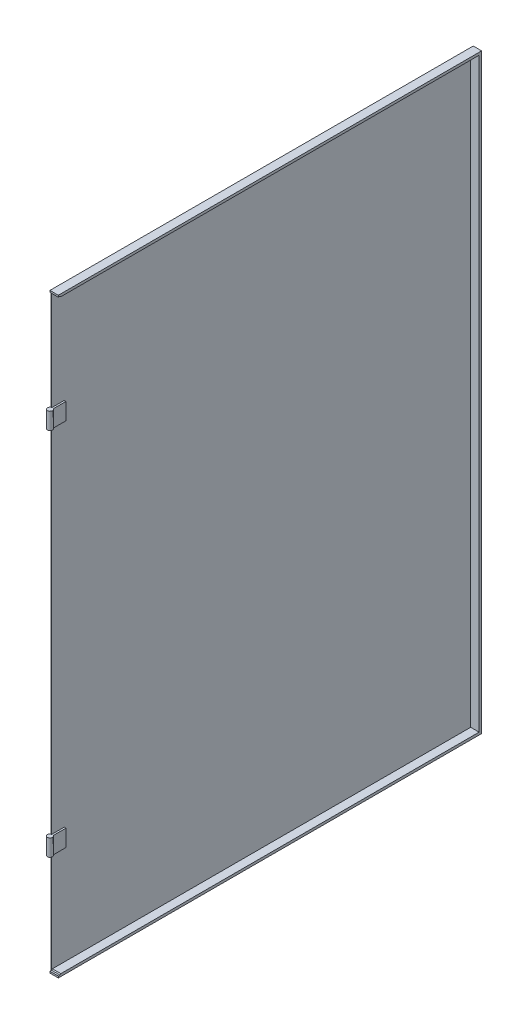
ISO-10303-21;
HEADER;
FILE_DESCRIPTION(('STEP AP214'),'2;1');
FILE_NAME('part.step','',(''),(''),'','','');
FILE_SCHEMA(('AUTOMOTIVE_DESIGN { 1 0 10303 214 1 1 1 1 }'));
ENDSEC;
DATA;
#1=APPLICATION_CONTEXT('core data for automotive mechanical design processes');
#2=APPLICATION_PROTOCOL_DEFINITION('international standard','automotive_design',2000,#1);
#3=PRODUCT_CONTEXT('',#1,'mechanical');
#4=PRODUCT('Part','Part','',(#3));
#5=PRODUCT_RELATED_PRODUCT_CATEGORY('part','',(#4));
#6=PRODUCT_DEFINITION_FORMATION('','',#4);
#7=PRODUCT_DEFINITION_CONTEXT('part definition',#1,'design');
#8=PRODUCT_DEFINITION('design','',#6,#7);
#9=PRODUCT_DEFINITION_SHAPE('','',#8);
#10=(LENGTH_UNIT() NAMED_UNIT(*) SI_UNIT(.MILLI.,.METRE.));
#11=(NAMED_UNIT(*) PLANE_ANGLE_UNIT() SI_UNIT($,.RADIAN.));
#12=(NAMED_UNIT(*) SI_UNIT($,.STERADIAN.) SOLID_ANGLE_UNIT());
#13=UNCERTAINTY_MEASURE_WITH_UNIT(LENGTH_MEASURE(1.E-05),#10,'distance_accuracy_value','');
#14=(GEOMETRIC_REPRESENTATION_CONTEXT(3) GLOBAL_UNCERTAINTY_ASSIGNED_CONTEXT((#13)) GLOBAL_UNIT_ASSIGNED_CONTEXT((#10,
#11,#12)) REPRESENTATION_CONTEXT('',''));
#15=CARTESIAN_POINT('',(0.,0.,0.));
#16=DIRECTION('',(0.,0.,1.));
#17=DIRECTION('',(1.,0.,0.));
#18=AXIS2_PLACEMENT_3D('',#15,#16,#17);
#19=CARTESIAN_POINT('',(0.,0.,500.));
#20=DIRECTION('',(0.,0.,-1.));
#21=DIRECTION('',(-1.,0.,0.));
#22=AXIS2_PLACEMENT_3D('',#19,#20,#21);
#23=PLANE('',#22);
#24=DIRECTION('',(1.,0.,0.));
#25=VECTOR('',#24,1.);
#26=CARTESIAN_POINT('',(-250.,-350.,500.));
#27=LINE('',#26,#25);
#28=CARTESIAN_POINT('',(-250.,-350.,500.));
#29=VERTEX_POINT('',#28);
#30=CARTESIAN_POINT('',(-249.,-350.,500.));
#31=VERTEX_POINT('',#30);
#32=EDGE_CURVE('E344',#29,#31,#27,.T.);
#33=ORIENTED_EDGE('',*,*,#32,.T.);
#34=DIRECTION('',(0.,-1.,0.));
#35=VECTOR('',#34,1.);
#36=CARTESIAN_POINT('',(-249.,0.,500.));
#37=LINE('',#36,#35);
#38=CARTESIAN_POINT('',(-249.,-230.,500.));
#39=VERTEX_POINT('',#38);
#40=EDGE_CURVE('E358',#39,#31,#37,.T.);
#41=ORIENTED_EDGE('',*,*,#40,.F.);
#42=DIRECTION('',(-1.,0.,0.));
#43=VECTOR('',#42,1.);
#44=CARTESIAN_POINT('',(0.,-230.,500.));
#45=LINE('',#44,#43);
#46=CARTESIAN_POINT('',(-250.,-230.,500.));
#47=VERTEX_POINT('',#46);
#48=EDGE_CURVE('E321',#39,#47,#45,.T.);
#49=ORIENTED_EDGE('',*,*,#48,.T.);
#50=DIRECTION('',(0.,-1.,0.));
#51=VECTOR('',#50,1.);
#52=CARTESIAN_POINT('',(-250.,-350.,500.));
#53=LINE('',#52,#51);
#54=EDGE_CURVE('E348',#47,#29,#53,.T.);
#55=ORIENTED_EDGE('',*,*,#54,.T.);
#56=EDGE_LOOP('',(#33,#41,#49,#55));
#57=FACE_BOUND('',#56,.T.);
#58=ADVANCED_FACE('F35',(#57),#23,.F.);
#59=CARTESIAN_POINT('',(-249.,350.,500.));
#60=VERTEX_POINT('',#59);
#61=CARTESIAN_POINT('',(-249.,230.,500.));
#62=VERTEX_POINT('',#61);
#63=EDGE_CURVE('E355',#60,#62,#37,.T.);
#64=ORIENTED_EDGE('',*,*,#63,.F.);
#65=DIRECTION('',(-1.,0.,0.));
#66=VECTOR('',#65,1.);
#67=CARTESIAN_POINT('',(-250.,350.,500.));
#68=LINE('',#67,#66);
#69=CARTESIAN_POINT('',(-250.,350.,500.));
#70=VERTEX_POINT('',#69);
#71=EDGE_CURVE('E347',#60,#70,#68,.T.);
#72=ORIENTED_EDGE('',*,*,#71,.T.);
#73=CARTESIAN_POINT('',(-250.,230.,500.));
#74=VERTEX_POINT('',#73);
#75=EDGE_CURVE('E349',#70,#74,#53,.T.);
#76=ORIENTED_EDGE('',*,*,#75,.T.);
#77=DIRECTION('',(-1.,0.,0.));
#78=VECTOR('',#77,1.);
#79=CARTESIAN_POINT('',(0.,230.,500.));
#80=LINE('',#79,#78);
#81=EDGE_CURVE('E413',#62,#74,#80,.T.);
#82=ORIENTED_EDGE('',*,*,#81,.F.);
#83=EDGE_LOOP('',(#64,#72,#76,#82));
#84=FACE_BOUND('',#83,.T.);
#85=ADVANCED_FACE('F443',(#84),#23,.F.);
#86=CARTESIAN_POINT('',(-250.,350.,500.));
#87=DIRECTION('',(0.,-1.,0.));
#88=DIRECTION('',(0.,0.,-1.));
#89=AXIS2_PLACEMENT_3D('',#86,#87,#88);
#90=PLANE('',#89);
#91=ORIENTED_EDGE('',*,*,#71,.F.);
#92=DIRECTION('',(0.,0.,-1.));
#93=VECTOR('',#92,1.);
#94=CARTESIAN_POINT('',(-249.,350.,500.));
#95=LINE('',#94,#93);
#96=CARTESIAN_POINT('',(-249.,350.,0.));
#97=VERTEX_POINT('',#96);
#98=EDGE_CURVE('E225',#60,#97,#95,.T.);
#99=ORIENTED_EDGE('',*,*,#98,.T.);
#100=DIRECTION('',(-1.,0.,0.));
#101=VECTOR('',#100,1.);
#102=CARTESIAN_POINT('',(-250.,350.,0.));
#103=LINE('',#102,#101);
#104=CARTESIAN_POINT('',(-250.,350.,0.));
#105=VERTEX_POINT('',#104);
#106=EDGE_CURVE('E339',#97,#105,#103,.T.);
#107=ORIENTED_EDGE('',*,*,#106,.T.);
#108=DIRECTION('',(0.,0.,-1.));
#109=VECTOR('',#108,1.);
#110=CARTESIAN_POINT('',(-250.,350.,500.));
#111=LINE('',#110,#109);
#112=EDGE_CURVE('E327',#70,#105,#111,.T.);
#113=ORIENTED_EDGE('',*,*,#112,.F.);
#114=EDGE_LOOP('',(#91,#99,#107,#113));
#115=FACE_BOUND('',#114,.T.);
#116=ADVANCED_FACE('F448',(#115),#90,.F.);
#117=CARTESIAN_POINT('',(-250.,-350.,500.));
#118=DIRECTION('',(0.,1.,0.));
#119=DIRECTION('',(0.,0.,1.));
#120=AXIS2_PLACEMENT_3D('',#117,#118,#119);
#121=PLANE('',#120);
#122=DIRECTION('',(1.,0.,0.));
#123=VECTOR('',#122,1.);
#124=CARTESIAN_POINT('',(-250.,-350.,0.));
#125=LINE('',#124,#123);
#126=CARTESIAN_POINT('',(-250.,-350.,0.));
#127=VERTEX_POINT('',#126);
#128=CARTESIAN_POINT('',(-249.,-350.,0.));
#129=VERTEX_POINT('',#128);
#130=EDGE_CURVE('E336',#127,#129,#125,.T.);
#131=ORIENTED_EDGE('',*,*,#130,.T.);
#132=DIRECTION('',(0.,0.,1.));
#133=VECTOR('',#132,1.);
#134=CARTESIAN_POINT('',(-249.,-350.,500.));
#135=LINE('',#134,#133);
#136=EDGE_CURVE('E318',#129,#31,#135,.T.);
#137=ORIENTED_EDGE('',*,*,#136,.T.);
#138=ORIENTED_EDGE('',*,*,#32,.F.);
#139=DIRECTION('',(0.,0.,-1.));
#140=VECTOR('',#139,1.);
#141=CARTESIAN_POINT('',(-250.,-350.,500.));
#142=LINE('',#141,#140);
#143=EDGE_CURVE('E332',#29,#127,#142,.T.);
#144=ORIENTED_EDGE('',*,*,#143,.T.);
#145=EDGE_LOOP('',(#131,#137,#138,#144));
#146=FACE_BOUND('',#145,.T.);
#147=ADVANCED_FACE('F457',(#146),#121,.F.);
#148=CARTESIAN_POINT('',(0.,0.,0.));
#149=DIRECTION('',(0.,0.,-1.));
#150=DIRECTION('',(-1.,0.,0.));
#151=AXIS2_PLACEMENT_3D('',#148,#149,#150);
#152=PLANE('',#151);
#153=ORIENTED_EDGE('',*,*,#106,.F.);
#154=DIRECTION('',(0.,1.,0.));
#155=VECTOR('',#154,1.);
#156=CARTESIAN_POINT('',(-249.,0.,0.));
#157=LINE('',#156,#155);
#158=EDGE_CURVE('E315',#129,#97,#157,.T.);
#159=ORIENTED_EDGE('',*,*,#158,.F.);
#160=ORIENTED_EDGE('',*,*,#130,.F.);
#161=DIRECTION('',(0.,-1.,0.));
#162=VECTOR('',#161,1.);
#163=CARTESIAN_POINT('',(-250.,-350.,0.));
#164=LINE('',#163,#162);
#165=EDGE_CURVE('E330',#105,#127,#164,.T.);
#166=ORIENTED_EDGE('',*,*,#165,.F.);
#167=EDGE_LOOP('',(#153,#159,#160,#166));
#168=FACE_BOUND('',#167,.T.);
#169=ADVANCED_FACE('F454',(#168),#152,.T.);
#170=CARTESIAN_POINT('',(-247.,210.,500.));
#171=DIRECTION('',(0.,1.,0.));
#172=DIRECTION('',(0.,0.,1.));
#173=AXIS2_PLACEMENT_3D('',#170,#171,#172);
#174=PLANE('',#173);
#175=DIRECTION('',(-1.,0.,0.));
#176=VECTOR('',#175,1.);
#177=CARTESIAN_POINT('',(0.,210.,500.));
#178=LINE('',#177,#176);
#179=CARTESIAN_POINT('',(-249.,210.,500.));
#180=VERTEX_POINT('',#179);
#181=CARTESIAN_POINT('',(-250.,210.,500.));
#182=VERTEX_POINT('',#181);
#183=EDGE_CURVE('E418',#180,#182,#178,.T.);
#184=ORIENTED_EDGE('',*,*,#183,.F.);
#185=DIRECTION('',(0.,0.,-1.));
#186=VECTOR('',#185,1.);
#187=CARTESIAN_POINT('',(-249.,210.,500.));
#188=LINE('',#187,#186);
#189=CARTESIAN_POINT('',(-249.,210.,485.));
#190=VERTEX_POINT('',#189);
#191=EDGE_CURVE('E335',#180,#190,#188,.T.);
#192=ORIENTED_EDGE('',*,*,#191,.T.);
#193=DIRECTION('',(-1.,0.,0.));
#194=VECTOR('',#193,1.);
#195=CARTESIAN_POINT('',(-247.,210.,485.));
#196=LINE('',#195,#194);
#197=CARTESIAN_POINT('',(-247.,210.,485.));
#198=VERTEX_POINT('',#197);
#199=EDGE_CURVE('E359',#198,#190,#196,.T.);
#200=ORIENTED_EDGE('',*,*,#199,.F.);
#201=DIRECTION('',(0.,0.,-1.));
#202=VECTOR('',#201,1.);
#203=CARTESIAN_POINT('',(-247.,210.,500.));
#204=LINE('',#203,#202);
#205=CARTESIAN_POINT('',(-247.,210.,499.901923788647));
#206=VERTEX_POINT('',#205);
#207=EDGE_CURVE('E376',#206,#198,#204,.T.);
#208=ORIENTED_EDGE('',*,*,#207,.F.);
#209=CARTESIAN_POINT('',(-248.5,210.,502.5));
#210=DIRECTION('',(0.,-1.,0.));
#211=DIRECTION('',(0.,0.,-1.));
#212=AXIS2_PLACEMENT_3D('',#209,#210,#211);
#213=CIRCLE('',#212,3.00000000000001);
#214=CARTESIAN_POINT('',(-250.,210.,499.901923788647));
#215=VERTEX_POINT('',#214);
#216=EDGE_CURVE('E352',#206,#215,#213,.T.);
#217=ORIENTED_EDGE('',*,*,#216,.T.);
#218=DIRECTION('',(0.,0.,-1.));
#219=VECTOR('',#218,1.);
#220=CARTESIAN_POINT('',(-250.,210.,500.));
#221=LINE('',#220,#219);
#222=EDGE_CURVE('E398',#182,#215,#221,.T.);
#223=ORIENTED_EDGE('',*,*,#222,.F.);
#224=EDGE_LOOP('',(#184,#192,#200,#208,#217,#223));
#225=FACE_BOUND('',#224,.T.);
#226=ADVANCED_FACE('F425',(#225),#174,.F.);
#227=CARTESIAN_POINT('',(-247.,230.,500.));
#228=DIRECTION('',(0.,-1.,0.));
#229=DIRECTION('',(0.,0.,-1.));
#230=AXIS2_PLACEMENT_3D('',#227,#228,#229);
#231=PLANE('',#230);
#232=DIRECTION('',(0.,0.,-1.));
#233=VECTOR('',#232,1.);
#234=CARTESIAN_POINT('',(-250.,230.,500.));
#235=LINE('',#234,#233);
#236=CARTESIAN_POINT('',(-250.,230.,499.901923788647));
#237=VERTEX_POINT('',#236);
#238=EDGE_CURVE('E409',#74,#237,#235,.T.);
#239=ORIENTED_EDGE('',*,*,#238,.T.);
#240=CARTESIAN_POINT('',(-248.5,230.,502.5));
#241=DIRECTION('',(0.,-1.,0.));
#242=DIRECTION('',(0.,0.,-1.));
#243=AXIS2_PLACEMENT_3D('',#240,#241,#242);
#244=CIRCLE('',#243,3.00000000000001);
#245=CARTESIAN_POINT('',(-247.,230.,499.901923788647));
#246=VERTEX_POINT('',#245);
#247=EDGE_CURVE('E39',#246,#237,#244,.T.);
#248=ORIENTED_EDGE('',*,*,#247,.F.);
#249=DIRECTION('',(0.,0.,1.));
#250=VECTOR('',#249,1.);
#251=CARTESIAN_POINT('',(-247.,230.,500.));
#252=LINE('',#251,#250);
#253=CARTESIAN_POINT('',(-247.,230.,485.));
#254=VERTEX_POINT('',#253);
#255=EDGE_CURVE('E371',#254,#246,#252,.T.);
#256=ORIENTED_EDGE('',*,*,#255,.F.);
#257=DIRECTION('',(-1.,0.,0.));
#258=VECTOR('',#257,1.);
#259=CARTESIAN_POINT('',(-247.,230.,485.));
#260=LINE('',#259,#258);
#261=CARTESIAN_POINT('',(-249.,230.,485.));
#262=VERTEX_POINT('',#261);
#263=EDGE_CURVE('E364',#254,#262,#260,.T.);
#264=ORIENTED_EDGE('',*,*,#263,.T.);
#265=DIRECTION('',(0.,0.,1.));
#266=VECTOR('',#265,1.);
#267=CARTESIAN_POINT('',(-249.,230.,500.));
#268=LINE('',#267,#266);
#269=EDGE_CURVE('E362',#262,#62,#268,.T.);
#270=ORIENTED_EDGE('',*,*,#269,.T.);
#271=ORIENTED_EDGE('',*,*,#81,.T.);
#272=EDGE_LOOP('',(#239,#248,#256,#264,#270,#271));
#273=FACE_BOUND('',#272,.T.);
#274=ADVANCED_FACE('F438',(#273),#231,.F.);
#275=CARTESIAN_POINT('',(-247.,-230.,500.));
#276=DIRECTION('',(0.,1.,0.));
#277=DIRECTION('',(0.,0.,1.));
#278=AXIS2_PLACEMENT_3D('',#275,#276,#277);
#279=PLANE('',#278);
#280=ORIENTED_EDGE('',*,*,#48,.F.);
#281=DIRECTION('',(0.,0.,-1.));
#282=VECTOR('',#281,1.);
#283=CARTESIAN_POINT('',(-249.,-230.,500.));
#284=LINE('',#283,#282);
#285=CARTESIAN_POINT('',(-249.,-230.,485.));
#286=VERTEX_POINT('',#285);
#287=EDGE_CURVE('E373',#39,#286,#284,.T.);
#288=ORIENTED_EDGE('',*,*,#287,.T.);
#289=DIRECTION('',(-1.,0.,0.));
#290=VECTOR('',#289,1.);
#291=CARTESIAN_POINT('',(-247.,-230.,485.));
#292=LINE('',#291,#290);
#293=CARTESIAN_POINT('',(-247.,-230.,485.));
#294=VERTEX_POINT('',#293);
#295=EDGE_CURVE('E378',#294,#286,#292,.T.);
#296=ORIENTED_EDGE('',*,*,#295,.F.);
#297=DIRECTION('',(0.,0.,-1.));
#298=VECTOR('',#297,1.);
#299=CARTESIAN_POINT('',(-247.,-230.,500.));
#300=LINE('',#299,#298);
#301=CARTESIAN_POINT('',(-247.,-230.,499.901923788647));
#302=VERTEX_POINT('',#301);
#303=EDGE_CURVE('E386',#302,#294,#300,.T.);
#304=ORIENTED_EDGE('',*,*,#303,.F.);
#305=CARTESIAN_POINT('',(-248.5,-230.,502.5));
#306=DIRECTION('',(0.,-1.,0.));
#307=DIRECTION('',(0.,0.,-1.));
#308=AXIS2_PLACEMENT_3D('',#305,#306,#307);
#309=CIRCLE('',#308,2.99999999999999);
#310=CARTESIAN_POINT('',(-250.,-230.,499.901923788647));
#311=VERTEX_POINT('',#310);
#312=EDGE_CURVE('E404',#302,#311,#309,.T.);
#313=ORIENTED_EDGE('',*,*,#312,.T.);
#314=DIRECTION('',(0.,0.,-1.));
#315=VECTOR('',#314,1.);
#316=CARTESIAN_POINT('',(-250.,-230.,500.));
#317=LINE('',#316,#315);
#318=EDGE_CURVE('E341',#47,#311,#317,.T.);
#319=ORIENTED_EDGE('',*,*,#318,.F.);
#320=EDGE_LOOP('',(#280,#288,#296,#304,#313,#319));
#321=FACE_BOUND('',#320,.T.);
#322=ADVANCED_FACE('F548',(#321),#279,.F.);
#323=CARTESIAN_POINT('',(-247.,-210.,500.));
#324=DIRECTION('',(0.,-1.,0.));
#325=DIRECTION('',(0.,0.,-1.));
#326=AXIS2_PLACEMENT_3D('',#323,#324,#325);
#327=PLANE('',#326);
#328=DIRECTION('',(0.,0.,-1.));
#329=VECTOR('',#328,1.);
#330=CARTESIAN_POINT('',(-250.,-210.,500.));
#331=LINE('',#330,#329);
#332=CARTESIAN_POINT('',(-250.,-210.,500.));
#333=VERTEX_POINT('',#332);
#334=CARTESIAN_POINT('',(-250.,-210.,499.901923788647));
#335=VERTEX_POINT('',#334);
#336=EDGE_CURVE('E331',#333,#335,#331,.T.);
#337=ORIENTED_EDGE('',*,*,#336,.T.);
#338=CARTESIAN_POINT('',(-248.5,-210.,502.5));
#339=DIRECTION('',(0.,-1.,0.));
#340=DIRECTION('',(0.,0.,-1.));
#341=AXIS2_PLACEMENT_3D('',#338,#339,#340);
#342=CIRCLE('',#341,2.99999999999999);
#343=CARTESIAN_POINT('',(-247.,-210.,499.901923788647));
#344=VERTEX_POINT('',#343);
#345=EDGE_CURVE('E325',#344,#335,#342,.T.);
#346=ORIENTED_EDGE('',*,*,#345,.F.);
#347=DIRECTION('',(0.,0.,1.));
#348=VECTOR('',#347,1.);
#349=CARTESIAN_POINT('',(-247.,-210.,500.));
#350=LINE('',#349,#348);
#351=CARTESIAN_POINT('',(-247.,-210.,485.));
#352=VERTEX_POINT('',#351);
#353=EDGE_CURVE('E326',#352,#344,#350,.T.);
#354=ORIENTED_EDGE('',*,*,#353,.F.);
#355=DIRECTION('',(-1.,0.,0.));
#356=VECTOR('',#355,1.);
#357=CARTESIAN_POINT('',(-247.,-210.,485.));
#358=LINE('',#357,#356);
#359=CARTESIAN_POINT('',(-249.,-210.,485.));
#360=VERTEX_POINT('',#359);
#361=EDGE_CURVE('E383',#352,#360,#358,.T.);
#362=ORIENTED_EDGE('',*,*,#361,.T.);
#363=DIRECTION('',(0.,0.,1.));
#364=VECTOR('',#363,1.);
#365=CARTESIAN_POINT('',(-249.,-210.,500.));
#366=LINE('',#365,#364);
#367=CARTESIAN_POINT('',(-249.,-210.,500.));
#368=VERTEX_POINT('',#367);
#369=EDGE_CURVE('E381',#360,#368,#366,.T.);
#370=ORIENTED_EDGE('',*,*,#369,.T.);
#371=DIRECTION('',(-1.,0.,0.));
#372=VECTOR('',#371,1.);
#373=CARTESIAN_POINT('',(0.,-210.,500.));
#374=LINE('',#373,#372);
#375=EDGE_CURVE('E401',#368,#333,#374,.T.);
#376=ORIENTED_EDGE('',*,*,#375,.T.);
#377=EDGE_LOOP('',(#337,#346,#354,#362,#370,#376));
#378=FACE_BOUND('',#377,.T.);
#379=ADVANCED_FACE('F523',(#378),#327,.F.);
#380=CARTESIAN_POINT('',(-250.,-350.,500.));
#381=DIRECTION('',(1.,0.,0.));
#382=DIRECTION('',(0.,0.,-1.));
#383=AXIS2_PLACEMENT_3D('',#380,#381,#382);
#384=PLANE('',#383);
#385=ORIENTED_EDGE('',*,*,#238,.F.);
#386=ORIENTED_EDGE('',*,*,#75,.F.);
#387=ORIENTED_EDGE('',*,*,#112,.T.);
#388=ORIENTED_EDGE('',*,*,#165,.T.);
#389=ORIENTED_EDGE('',*,*,#143,.F.);
#390=ORIENTED_EDGE('',*,*,#54,.F.);
#391=ORIENTED_EDGE('',*,*,#318,.T.);
#392=DIRECTION('',(0.,-1.,0.));
#393=VECTOR('',#392,1.);
#394=CARTESIAN_POINT('',(-250.,-210.,499.901923788647));
#395=LINE('',#394,#393);
#396=EDGE_CURVE('E395',#311,#335,#395,.F.);
#397=ORIENTED_EDGE('',*,*,#396,.T.);
#398=ORIENTED_EDGE('',*,*,#336,.F.);
#399=EDGE_CURVE('E353',#182,#333,#53,.T.);
#400=ORIENTED_EDGE('',*,*,#399,.F.);
#401=ORIENTED_EDGE('',*,*,#222,.T.);
#402=DIRECTION('',(0.,-1.,0.));
#403=VECTOR('',#402,1.);
#404=CARTESIAN_POINT('',(-250.,230.,499.901923788647));
#405=LINE('',#404,#403);
#406=EDGE_CURVE('E11',#237,#215,#405,.T.);
#407=ORIENTED_EDGE('',*,*,#406,.F.);
#408=EDGE_LOOP('',(#385,#386,#387,#388,#389,#390,#391,#397,#398,#400,#401,#407));
#409=FACE_BOUND('',#408,.T.);
#410=ADVANCED_FACE('F432',(#409),#384,.F.);
#411=EDGE_CURVE('E343',#180,#368,#37,.T.);
#412=ORIENTED_EDGE('',*,*,#411,.F.);
#413=ORIENTED_EDGE('',*,*,#183,.T.);
#414=ORIENTED_EDGE('',*,*,#399,.T.);
#415=ORIENTED_EDGE('',*,*,#375,.F.);
#416=EDGE_LOOP('',(#412,#413,#414,#415));
#417=FACE_BOUND('',#416,.T.);
#418=ADVANCED_FACE('F37',(#417),#23,.F.);
#419=CARTESIAN_POINT('',(-249.,-350.,500.));
#420=DIRECTION('',(1.,0.,0.));
#421=DIRECTION('',(0.,0.,-1.));
#422=AXIS2_PLACEMENT_3D('',#419,#420,#421);
#423=PLANE('',#422);
#424=DIRECTION('',(0.,0.707106781186548,-0.707106781186548));
#425=VECTOR('',#424,1.);
#426=CARTESIAN_POINT('',(-249.,75.,75.));
#427=LINE('',#426,#425);
#428=CARTESIAN_POINT('',(-249.,-349.,499.));
#429=VERTEX_POINT('',#428);
#430=EDGE_CURVE('E51',#31,#429,#427,.T.);
#431=ORIENTED_EDGE('',*,*,#430,.T.);
#432=DIRECTION('',(0.,0.,-1.));
#433=VECTOR('',#432,1.);
#434=CARTESIAN_POINT('',(-249.,-349.,0.));
#435=LINE('',#434,#433);
#436=CARTESIAN_POINT('',(-249.,-349.,1.));
#437=VERTEX_POINT('',#436);
#438=EDGE_CURVE('E56',#429,#437,#435,.T.);
#439=ORIENTED_EDGE('',*,*,#438,.T.);
#440=DIRECTION('',(0.,1.,0.));
#441=VECTOR('',#440,1.);
#442=CARTESIAN_POINT('',(-249.,0.,1.));
#443=LINE('',#442,#441);
#444=CARTESIAN_POINT('',(-249.,349.,1.));
#445=VERTEX_POINT('',#444);
#446=EDGE_CURVE('E266',#437,#445,#443,.T.);
#447=ORIENTED_EDGE('',*,*,#446,.T.);
#448=DIRECTION('',(0.,0.,1.));
#449=VECTOR('',#448,1.);
#450=CARTESIAN_POINT('',(-249.,349.,0.));
#451=LINE('',#450,#449);
#452=CARTESIAN_POINT('',(-249.,349.,499.));
#453=VERTEX_POINT('',#452);
#454=EDGE_CURVE('E221',#445,#453,#451,.T.);
#455=ORIENTED_EDGE('',*,*,#454,.T.);
#456=DIRECTION('',(0.,0.707106781186548,0.707106781186548));
#457=VECTOR('',#456,1.);
#458=CARTESIAN_POINT('',(-249.,-75.,75.));
#459=LINE('',#458,#457);
#460=EDGE_CURVE('E237',#453,#60,#459,.T.);
#461=ORIENTED_EDGE('',*,*,#460,.T.);
#462=ORIENTED_EDGE('',*,*,#63,.T.);
#463=ORIENTED_EDGE('',*,*,#269,.F.);
#464=DIRECTION('',(0.,1.,0.));
#465=VECTOR('',#464,1.);
#466=CARTESIAN_POINT('',(-249.,230.,485.));
#467=LINE('',#466,#465);
#468=EDGE_CURVE('E363',#190,#262,#467,.T.);
#469=ORIENTED_EDGE('',*,*,#468,.F.);
#470=ORIENTED_EDGE('',*,*,#191,.F.);
#471=ORIENTED_EDGE('',*,*,#411,.T.);
#472=ORIENTED_EDGE('',*,*,#369,.F.);
#473=DIRECTION('',(0.,1.,0.));
#474=VECTOR('',#473,1.);
#475=CARTESIAN_POINT('',(-249.,-210.,485.));
#476=LINE('',#475,#474);
#477=EDGE_CURVE('E382',#286,#360,#476,.T.);
#478=ORIENTED_EDGE('',*,*,#477,.F.);
#479=ORIENTED_EDGE('',*,*,#287,.F.);
#480=ORIENTED_EDGE('',*,*,#40,.T.);
#481=EDGE_LOOP('',(#431,#439,#447,#455,#461,#462,#463,#469,#470,#471,#472,#478,#479,#480));
#482=FACE_BOUND('',#481,.T.);
#483=ADVANCED_FACE('F473',(#482),#423,.T.);
#484=CARTESIAN_POINT('',(-247.,230.,485.));
#485=DIRECTION('',(0.,0.,1.));
#486=DIRECTION('',(1.,0.,0.));
#487=AXIS2_PLACEMENT_3D('',#484,#485,#486);
#488=PLANE('',#487);
#489=ORIENTED_EDGE('',*,*,#468,.T.);
#490=ORIENTED_EDGE('',*,*,#263,.F.);
#491=DIRECTION('',(0.,1.,0.));
#492=VECTOR('',#491,1.);
#493=CARTESIAN_POINT('',(-247.,230.,485.));
#494=LINE('',#493,#492);
#495=EDGE_CURVE('E374',#198,#254,#494,.T.);
#496=ORIENTED_EDGE('',*,*,#495,.F.);
#497=ORIENTED_EDGE('',*,*,#199,.T.);
#498=EDGE_LOOP('',(#489,#490,#496,#497));
#499=FACE_BOUND('',#498,.T.);
#500=ADVANCED_FACE('F521',(#499),#488,.F.);
#501=CARTESIAN_POINT('',(-247.,0.,0.));
#502=DIRECTION('',(1.,0.,0.));
#503=DIRECTION('',(0.,0.,-1.));
#504=AXIS2_PLACEMENT_3D('',#501,#502,#503);
#505=PLANE('',#504);
#506=DIRECTION('',(0.,-1.,0.));
#507=VECTOR('',#506,1.);
#508=CARTESIAN_POINT('',(-247.,230.,499.901923788647));
#509=LINE('',#508,#507);
#510=EDGE_CURVE('E366',#246,#206,#509,.T.);
#511=ORIENTED_EDGE('',*,*,#510,.T.);
#512=ORIENTED_EDGE('',*,*,#207,.T.);
#513=ORIENTED_EDGE('',*,*,#495,.T.);
#514=ORIENTED_EDGE('',*,*,#255,.T.);
#515=EDGE_LOOP('',(#511,#512,#513,#514));
#516=FACE_BOUND('',#515,.T.);
#517=ADVANCED_FACE('F534',(#516),#505,.T.);
#518=CARTESIAN_POINT('',(-247.,-210.,485.));
#519=DIRECTION('',(0.,0.,1.));
#520=DIRECTION('',(1.,0.,0.));
#521=AXIS2_PLACEMENT_3D('',#518,#519,#520);
#522=PLANE('',#521);
#523=ORIENTED_EDGE('',*,*,#477,.T.);
#524=ORIENTED_EDGE('',*,*,#361,.F.);
#525=DIRECTION('',(0.,1.,0.));
#526=VECTOR('',#525,1.);
#527=CARTESIAN_POINT('',(-247.,-210.,485.));
#528=LINE('',#527,#526);
#529=EDGE_CURVE('E392',#294,#352,#528,.T.);
#530=ORIENTED_EDGE('',*,*,#529,.F.);
#531=ORIENTED_EDGE('',*,*,#295,.T.);
#532=EDGE_LOOP('',(#523,#524,#530,#531));
#533=FACE_BOUND('',#532,.T.);
#534=ADVANCED_FACE('F536',(#533),#522,.F.);
#535=CARTESIAN_POINT('',(-247.,0.,0.));
#536=DIRECTION('',(1.,0.,0.));
#537=DIRECTION('',(0.,0.,-1.));
#538=AXIS2_PLACEMENT_3D('',#535,#536,#537);
#539=PLANE('',#538);
#540=DIRECTION('',(0.,-1.,0.));
#541=VECTOR('',#540,1.);
#542=CARTESIAN_POINT('',(-247.,-210.,499.901923788647));
#543=LINE('',#542,#541);
#544=EDGE_CURVE('E322',#302,#344,#543,.F.);
#545=ORIENTED_EDGE('',*,*,#544,.F.);
#546=ORIENTED_EDGE('',*,*,#303,.T.);
#547=ORIENTED_EDGE('',*,*,#529,.T.);
#548=ORIENTED_EDGE('',*,*,#353,.T.);
#549=EDGE_LOOP('',(#545,#546,#547,#548));
#550=FACE_BOUND('',#549,.T.);
#551=ADVANCED_FACE('F542',(#550),#539,.T.);
#552=CARTESIAN_POINT('',(-248.5,-210.,502.5));
#553=DIRECTION('',(0.,-1.,0.));
#554=DIRECTION('',(0.,0.,-1.));
#555=AXIS2_PLACEMENT_3D('',#552,#553,#554);
#556=CYLINDRICAL_SURFACE('',#555,2.99999999999999);
#557=ORIENTED_EDGE('',*,*,#396,.F.);
#558=ORIENTED_EDGE('',*,*,#312,.F.);
#559=ORIENTED_EDGE('',*,*,#544,.T.);
#560=ORIENTED_EDGE('',*,*,#345,.T.);
#561=EDGE_LOOP('',(#557,#558,#559,#560));
#562=FACE_BOUND('',#561,.T.);
#563=ADVANCED_FACE('F557',(#562),#556,.T.);
#564=CARTESIAN_POINT('',(-248.5,230.,502.5));
#565=DIRECTION('',(0.,-1.,0.));
#566=DIRECTION('',(0.,0.,-1.));
#567=AXIS2_PLACEMENT_3D('',#564,#565,#566);
#568=CYLINDRICAL_SURFACE('',#567,3.00000000000001);
#569=ORIENTED_EDGE('',*,*,#216,.F.);
#570=ORIENTED_EDGE('',*,*,#510,.F.);
#571=ORIENTED_EDGE('',*,*,#247,.T.);
#572=ORIENTED_EDGE('',*,*,#406,.T.);
#573=EDGE_LOOP('',(#569,#570,#571,#572));
#574=FACE_BOUND('',#573,.T.);
#575=ADVANCED_FACE('F434',(#574),#568,.T.);
#576=CARTESIAN_POINT('',(-249.,0.,0.));
#577=DIRECTION('',(1.,0.,0.));
#578=DIRECTION('',(0.,0.,-1.));
#579=AXIS2_PLACEMENT_3D('',#576,#577,#578);
#580=PLANE('',#579);
#581=ORIENTED_EDGE('',*,*,#158,.T.);
#582=ORIENTED_EDGE('',*,*,#98,.F.);
#583=DIRECTION('',(0.,0.,1.));
#584=VECTOR('',#583,1.);
#585=CARTESIAN_POINT('',(-249.,350.,0.));
#586=LINE('',#585,#584);
#587=CARTESIAN_POINT('',(-249.,350.,502.));
#588=VERTEX_POINT('',#587);
#589=EDGE_CURVE('E284',#60,#588,#586,.T.);
#590=ORIENTED_EDGE('',*,*,#589,.T.);
#591=DIRECTION('',(0.,-1.,0.));
#592=VECTOR('',#591,1.);
#593=CARTESIAN_POINT('',(-249.,0.,502.));
#594=LINE('',#593,#592);
#595=CARTESIAN_POINT('',(-249.,352.,502.));
#596=VERTEX_POINT('',#595);
#597=EDGE_CURVE('E281',#596,#588,#594,.T.);
#598=ORIENTED_EDGE('',*,*,#597,.F.);
#599=DIRECTION('',(0.,0.,1.));
#600=VECTOR('',#599,1.);
#601=CARTESIAN_POINT('',(-249.,352.,0.));
#602=LINE('',#601,#600);
#603=CARTESIAN_POINT('',(-249.,352.,-2.));
#604=VERTEX_POINT('',#603);
#605=EDGE_CURVE('E279',#604,#596,#602,.T.);
#606=ORIENTED_EDGE('',*,*,#605,.F.);
#607=DIRECTION('',(0.,1.,0.));
#608=VECTOR('',#607,1.);
#609=CARTESIAN_POINT('',(-249.,0.,-2.));
#610=LINE('',#609,#608);
#611=CARTESIAN_POINT('',(-249.,-352.,-2.));
#612=VERTEX_POINT('',#611);
#613=EDGE_CURVE('E277',#612,#604,#610,.T.);
#614=ORIENTED_EDGE('',*,*,#613,.F.);
#615=DIRECTION('',(0.,0.,-1.));
#616=VECTOR('',#615,1.);
#617=CARTESIAN_POINT('',(-249.,-352.,0.));
#618=LINE('',#617,#616);
#619=CARTESIAN_POINT('',(-249.,-352.,502.));
#620=VERTEX_POINT('',#619);
#621=EDGE_CURVE('E275',#620,#612,#618,.T.);
#622=ORIENTED_EDGE('',*,*,#621,.F.);
#623=DIRECTION('',(0.,-1.,0.));
#624=VECTOR('',#623,1.);
#625=CARTESIAN_POINT('',(-249.,0.,502.));
#626=LINE('',#625,#624);
#627=CARTESIAN_POINT('',(-249.,-350.,502.));
#628=VERTEX_POINT('',#627);
#629=EDGE_CURVE('E273',#628,#620,#626,.T.);
#630=ORIENTED_EDGE('',*,*,#629,.F.);
#631=DIRECTION('',(0.,0.,-1.));
#632=VECTOR('',#631,1.);
#633=CARTESIAN_POINT('',(-249.,-350.,0.));
#634=LINE('',#633,#632);
#635=EDGE_CURVE('E270',#628,#31,#634,.T.);
#636=ORIENTED_EDGE('',*,*,#635,.T.);
#637=ORIENTED_EDGE('',*,*,#136,.F.);
#638=EDGE_LOOP('',(#581,#582,#590,#598,#606,#614,#622,#630,#636,#637));
#639=FACE_BOUND('',#638,.T.);
#640=ADVANCED_FACE('F460',(#639),#580,.F.);
#641=CARTESIAN_POINT('',(-239.,349.,0.));
#642=DIRECTION('',(0.,-1.,0.));
#643=DIRECTION('',(0.,0.,-1.));
#644=AXIS2_PLACEMENT_3D('',#641,#642,#643);
#645=PLANE('',#644);
#646=ORIENTED_EDGE('',*,*,#454,.F.);
#647=DIRECTION('',(-1.,0.,0.));
#648=VECTOR('',#647,1.);
#649=CARTESIAN_POINT('',(-239.,349.,1.));
#650=LINE('',#649,#648);
#651=CARTESIAN_POINT('',(-239.,349.,1.));
#652=VERTEX_POINT('',#651);
#653=EDGE_CURVE('E215',#652,#445,#650,.T.);
#654=ORIENTED_EDGE('',*,*,#653,.F.);
#655=DIRECTION('',(0.,0.,1.));
#656=VECTOR('',#655,1.);
#657=CARTESIAN_POINT('',(-239.,349.,0.));
#658=LINE('',#657,#656);
#659=CARTESIAN_POINT('',(-239.,349.,499.));
#660=VERTEX_POINT('',#659);
#661=EDGE_CURVE('E219',#652,#660,#658,.T.);
#662=ORIENTED_EDGE('',*,*,#661,.T.);
#663=DIRECTION('',(-1.,0.,0.));
#664=VECTOR('',#663,1.);
#665=CARTESIAN_POINT('',(-239.,349.,499.));
#666=LINE('',#665,#664);
#667=EDGE_CURVE('E264',#660,#453,#666,.T.);
#668=ORIENTED_EDGE('',*,*,#667,.T.);
#669=EDGE_LOOP('',(#646,#654,#662,#668));
#670=FACE_BOUND('',#669,.T.);
#671=ADVANCED_FACE('F217',(#670),#645,.T.);
#672=CARTESIAN_POINT('',(-239.,0.,1.));
#673=DIRECTION('',(0.,0.,1.));
#674=DIRECTION('',(1.,0.,0.));
#675=AXIS2_PLACEMENT_3D('',#672,#673,#674);
#676=PLANE('',#675);
#677=ORIENTED_EDGE('',*,*,#446,.F.);
#678=DIRECTION('',(-1.,0.,0.));
#679=VECTOR('',#678,1.);
#680=CARTESIAN_POINT('',(-239.,-349.,1.));
#681=LINE('',#680,#679);
#682=CARTESIAN_POINT('',(-239.,-349.,1.));
#683=VERTEX_POINT('',#682);
#684=EDGE_CURVE('E226',#683,#437,#681,.T.);
#685=ORIENTED_EDGE('',*,*,#684,.F.);
#686=DIRECTION('',(0.,1.,0.));
#687=VECTOR('',#686,1.);
#688=CARTESIAN_POINT('',(-239.,0.,1.));
#689=LINE('',#688,#687);
#690=EDGE_CURVE('E232',#683,#652,#689,.T.);
#691=ORIENTED_EDGE('',*,*,#690,.T.);
#692=ORIENTED_EDGE('',*,*,#653,.T.);
#693=EDGE_LOOP('',(#677,#685,#691,#692));
#694=FACE_BOUND('',#693,.T.);
#695=ADVANCED_FACE('F239',(#694),#676,.T.);
#696=CARTESIAN_POINT('',(-239.,-349.,0.));
#697=DIRECTION('',(0.,1.,0.));
#698=DIRECTION('',(0.,0.,1.));
#699=AXIS2_PLACEMENT_3D('',#696,#697,#698);
#700=PLANE('',#699);
#701=ORIENTED_EDGE('',*,*,#438,.F.);
#702=DIRECTION('',(-1.,0.,0.));
#703=VECTOR('',#702,1.);
#704=CARTESIAN_POINT('',(-239.,-349.,499.));
#705=LINE('',#704,#703);
#706=CARTESIAN_POINT('',(-239.,-349.,499.));
#707=VERTEX_POINT('',#706);
#708=EDGE_CURVE('E311',#707,#429,#705,.T.);
#709=ORIENTED_EDGE('',*,*,#708,.F.);
#710=DIRECTION('',(0.,0.,-1.));
#711=VECTOR('',#710,1.);
#712=CARTESIAN_POINT('',(-239.,-349.,0.));
#713=LINE('',#712,#711);
#714=EDGE_CURVE('E240',#707,#683,#713,.T.);
#715=ORIENTED_EDGE('',*,*,#714,.T.);
#716=ORIENTED_EDGE('',*,*,#684,.T.);
#717=EDGE_LOOP('',(#701,#709,#715,#716));
#718=FACE_BOUND('',#717,.T.);
#719=ADVANCED_FACE('F472',(#718),#700,.T.);
#720=CARTESIAN_POINT('',(-239.,75.,75.));
#721=DIRECTION('',(0.,0.707106781186548,0.707106781186548));
#722=DIRECTION('',(0.,-0.707106781186548,0.707106781186548));
#723=AXIS2_PLACEMENT_3D('',#720,#721,#722);
#724=PLANE('',#723);
#725=ORIENTED_EDGE('',*,*,#430,.F.);
#726=DIRECTION('',(-1.,0.,0.));
#727=VECTOR('',#726,1.);
#728=CARTESIAN_POINT('',(-239.,-350.,500.));
#729=LINE('',#728,#727);
#730=CARTESIAN_POINT('',(-239.,-350.,500.));
#731=VERTEX_POINT('',#730);
#732=EDGE_CURVE('E308',#731,#31,#729,.T.);
#733=ORIENTED_EDGE('',*,*,#732,.F.);
#734=DIRECTION('',(0.,0.707106781186548,-0.707106781186548));
#735=VECTOR('',#734,1.);
#736=CARTESIAN_POINT('',(-239.,75.,75.));
#737=LINE('',#736,#735);
#738=EDGE_CURVE('E242',#731,#707,#737,.T.);
#739=ORIENTED_EDGE('',*,*,#738,.T.);
#740=ORIENTED_EDGE('',*,*,#708,.T.);
#741=EDGE_LOOP('',(#725,#733,#739,#740));
#742=FACE_BOUND('',#741,.T.);
#743=ADVANCED_FACE('F470',(#742),#724,.T.);
#744=CARTESIAN_POINT('',(-239.,-350.,0.));
#745=DIRECTION('',(0.,1.,0.));
#746=DIRECTION('',(0.,0.,1.));
#747=AXIS2_PLACEMENT_3D('',#744,#745,#746);
#748=PLANE('',#747);
#749=ORIENTED_EDGE('',*,*,#635,.F.);
#750=DIRECTION('',(-1.,0.,0.));
#751=VECTOR('',#750,1.);
#752=CARTESIAN_POINT('',(-239.,-350.,502.));
#753=LINE('',#752,#751);
#754=CARTESIAN_POINT('',(-239.,-350.,502.));
#755=VERTEX_POINT('',#754);
#756=EDGE_CURVE('E306',#755,#628,#753,.T.);
#757=ORIENTED_EDGE('',*,*,#756,.F.);
#758=DIRECTION('',(0.,0.,-1.));
#759=VECTOR('',#758,1.);
#760=CARTESIAN_POINT('',(-239.,-350.,0.));
#761=LINE('',#760,#759);
#762=EDGE_CURVE('E247',#755,#731,#761,.T.);
#763=ORIENTED_EDGE('',*,*,#762,.T.);
#764=ORIENTED_EDGE('',*,*,#732,.T.);
#765=EDGE_LOOP('',(#749,#757,#763,#764));
#766=FACE_BOUND('',#765,.T.);
#767=ADVANCED_FACE('F465',(#766),#748,.T.);
#768=CARTESIAN_POINT('',(-239.,0.,502.));
#769=DIRECTION('',(0.,0.,-1.));
#770=DIRECTION('',(-1.,0.,0.));
#771=AXIS2_PLACEMENT_3D('',#768,#769,#770);
#772=PLANE('',#771);
#773=ORIENTED_EDGE('',*,*,#629,.T.);
#774=DIRECTION('',(-1.,0.,0.));
#775=VECTOR('',#774,1.);
#776=CARTESIAN_POINT('',(-239.,-352.,502.));
#777=LINE('',#776,#775);
#778=CARTESIAN_POINT('',(-239.,-352.,502.));
#779=VERTEX_POINT('',#778);
#780=EDGE_CURVE('E303',#779,#620,#777,.T.);
#781=ORIENTED_EDGE('',*,*,#780,.F.);
#782=DIRECTION('',(0.,-1.,0.));
#783=VECTOR('',#782,1.);
#784=CARTESIAN_POINT('',(-239.,0.,502.));
#785=LINE('',#784,#783);
#786=EDGE_CURVE('E250',#755,#779,#785,.T.);
#787=ORIENTED_EDGE('',*,*,#786,.F.);
#788=ORIENTED_EDGE('',*,*,#756,.T.);
#789=EDGE_LOOP('',(#773,#781,#787,#788));
#790=FACE_BOUND('',#789,.T.);
#791=ADVANCED_FACE('F501',(#790),#772,.F.);
#792=CARTESIAN_POINT('',(-239.,-352.,0.));
#793=DIRECTION('',(0.,1.,0.));
#794=DIRECTION('',(0.,0.,1.));
#795=AXIS2_PLACEMENT_3D('',#792,#793,#794);
#796=PLANE('',#795);
#797=ORIENTED_EDGE('',*,*,#621,.T.);
#798=DIRECTION('',(-1.,0.,0.));
#799=VECTOR('',#798,1.);
#800=CARTESIAN_POINT('',(-239.,-352.,-2.));
#801=LINE('',#800,#799);
#802=CARTESIAN_POINT('',(-239.,-352.,-2.));
#803=VERTEX_POINT('',#802);
#804=EDGE_CURVE('E300',#803,#612,#801,.T.);
#805=ORIENTED_EDGE('',*,*,#804,.F.);
#806=DIRECTION('',(0.,0.,-1.));
#807=VECTOR('',#806,1.);
#808=CARTESIAN_POINT('',(-239.,-352.,0.));
#809=LINE('',#808,#807);
#810=EDGE_CURVE('E252',#779,#803,#809,.T.);
#811=ORIENTED_EDGE('',*,*,#810,.F.);
#812=ORIENTED_EDGE('',*,*,#780,.T.);
#813=EDGE_LOOP('',(#797,#805,#811,#812));
#814=FACE_BOUND('',#813,.T.);
#815=ADVANCED_FACE('F497',(#814),#796,.F.);
#816=CARTESIAN_POINT('',(-239.,0.,-2.));
#817=DIRECTION('',(0.,0.,1.));
#818=DIRECTION('',(1.,0.,0.));
#819=AXIS2_PLACEMENT_3D('',#816,#817,#818);
#820=PLANE('',#819);
#821=ORIENTED_EDGE('',*,*,#613,.T.);
#822=DIRECTION('',(-1.,0.,0.));
#823=VECTOR('',#822,1.);
#824=CARTESIAN_POINT('',(-239.,352.,-2.));
#825=LINE('',#824,#823);
#826=CARTESIAN_POINT('',(-239.,352.,-2.));
#827=VERTEX_POINT('',#826);
#828=EDGE_CURVE('E297',#827,#604,#825,.T.);
#829=ORIENTED_EDGE('',*,*,#828,.F.);
#830=DIRECTION('',(0.,1.,0.));
#831=VECTOR('',#830,1.);
#832=CARTESIAN_POINT('',(-239.,0.,-2.));
#833=LINE('',#832,#831);
#834=EDGE_CURVE('E254',#803,#827,#833,.T.);
#835=ORIENTED_EDGE('',*,*,#834,.F.);
#836=ORIENTED_EDGE('',*,*,#804,.T.);
#837=EDGE_LOOP('',(#821,#829,#835,#836));
#838=FACE_BOUND('',#837,.T.);
#839=ADVANCED_FACE('F494',(#838),#820,.F.);
#840=CARTESIAN_POINT('',(-239.,352.,0.));
#841=DIRECTION('',(0.,-1.,0.));
#842=DIRECTION('',(0.,0.,-1.));
#843=AXIS2_PLACEMENT_3D('',#840,#841,#842);
#844=PLANE('',#843);
#845=ORIENTED_EDGE('',*,*,#605,.T.);
#846=DIRECTION('',(-1.,0.,0.));
#847=VECTOR('',#846,1.);
#848=CARTESIAN_POINT('',(-239.,352.,502.));
#849=LINE('',#848,#847);
#850=CARTESIAN_POINT('',(-239.,352.,502.));
#851=VERTEX_POINT('',#850);
#852=EDGE_CURVE('E294',#851,#596,#849,.T.);
#853=ORIENTED_EDGE('',*,*,#852,.F.);
#854=DIRECTION('',(0.,0.,1.));
#855=VECTOR('',#854,1.);
#856=CARTESIAN_POINT('',(-239.,352.,0.));
#857=LINE('',#856,#855);
#858=EDGE_CURVE('E256',#827,#851,#857,.T.);
#859=ORIENTED_EDGE('',*,*,#858,.F.);
#860=ORIENTED_EDGE('',*,*,#828,.T.);
#861=EDGE_LOOP('',(#845,#853,#859,#860));
#862=FACE_BOUND('',#861,.T.);
#863=ADVANCED_FACE('F490',(#862),#844,.F.);
#864=CARTESIAN_POINT('',(-239.,0.,502.));
#865=DIRECTION('',(0.,0.,-1.));
#866=DIRECTION('',(-1.,0.,0.));
#867=AXIS2_PLACEMENT_3D('',#864,#865,#866);
#868=PLANE('',#867);
#869=ORIENTED_EDGE('',*,*,#597,.T.);
#870=DIRECTION('',(-1.,0.,0.));
#871=VECTOR('',#870,1.);
#872=CARTESIAN_POINT('',(-239.,350.,502.));
#873=LINE('',#872,#871);
#874=CARTESIAN_POINT('',(-239.,350.,502.));
#875=VERTEX_POINT('',#874);
#876=EDGE_CURVE('E292',#875,#588,#873,.T.);
#877=ORIENTED_EDGE('',*,*,#876,.F.);
#878=DIRECTION('',(0.,-1.,0.));
#879=VECTOR('',#878,1.);
#880=CARTESIAN_POINT('',(-239.,0.,502.));
#881=LINE('',#880,#879);
#882=EDGE_CURVE('E258',#851,#875,#881,.T.);
#883=ORIENTED_EDGE('',*,*,#882,.F.);
#884=ORIENTED_EDGE('',*,*,#852,.T.);
#885=EDGE_LOOP('',(#869,#877,#883,#884));
#886=FACE_BOUND('',#885,.T.);
#887=ADVANCED_FACE('F485',(#886),#868,.F.);
#888=CARTESIAN_POINT('',(-239.,350.,0.));
#889=DIRECTION('',(0.,-1.,0.));
#890=DIRECTION('',(0.,0.,-1.));
#891=AXIS2_PLACEMENT_3D('',#888,#889,#890);
#892=PLANE('',#891);
#893=ORIENTED_EDGE('',*,*,#589,.F.);
#894=DIRECTION('',(-1.,0.,0.));
#895=VECTOR('',#894,1.);
#896=CARTESIAN_POINT('',(-239.,350.,500.));
#897=LINE('',#896,#895);
#898=CARTESIAN_POINT('',(-239.,350.,500.));
#899=VERTEX_POINT('',#898);
#900=EDGE_CURVE('E289',#899,#60,#897,.T.);
#901=ORIENTED_EDGE('',*,*,#900,.F.);
#902=DIRECTION('',(0.,0.,1.));
#903=VECTOR('',#902,1.);
#904=CARTESIAN_POINT('',(-239.,350.,0.));
#905=LINE('',#904,#903);
#906=EDGE_CURVE('E260',#899,#875,#905,.T.);
#907=ORIENTED_EDGE('',*,*,#906,.T.);
#908=ORIENTED_EDGE('',*,*,#876,.T.);
#909=EDGE_LOOP('',(#893,#901,#907,#908));
#910=FACE_BOUND('',#909,.T.);
#911=ADVANCED_FACE('F479',(#910),#892,.T.);
#912=CARTESIAN_POINT('',(-239.,-75.,75.));
#913=DIRECTION('',(0.,-0.707106781186548,0.707106781186548));
#914=DIRECTION('',(0.,-0.707106781186548,-0.707106781186548));
#915=AXIS2_PLACEMENT_3D('',#912,#913,#914);
#916=PLANE('',#915);
#917=ORIENTED_EDGE('',*,*,#460,.F.);
#918=ORIENTED_EDGE('',*,*,#667,.F.);
#919=DIRECTION('',(0.,0.707106781186548,0.707106781186548));
#920=VECTOR('',#919,1.);
#921=CARTESIAN_POINT('',(-239.,-75.,75.));
#922=LINE('',#921,#920);
#923=EDGE_CURVE('E236',#660,#899,#922,.T.);
#924=ORIENTED_EDGE('',*,*,#923,.T.);
#925=ORIENTED_EDGE('',*,*,#900,.T.);
#926=EDGE_LOOP('',(#917,#918,#924,#925));
#927=FACE_BOUND('',#926,.T.);
#928=ADVANCED_FACE('F476',(#927),#916,.T.);
#929=CARTESIAN_POINT('',(-239.,0.,0.));
#930=DIRECTION('',(1.,0.,0.));
#931=DIRECTION('',(0.,0.,-1.));
#932=AXIS2_PLACEMENT_3D('',#929,#930,#931);
#933=PLANE('',#932);
#934=ORIENTED_EDGE('',*,*,#661,.F.);
#935=ORIENTED_EDGE('',*,*,#690,.F.);
#936=ORIENTED_EDGE('',*,*,#714,.F.);
#937=ORIENTED_EDGE('',*,*,#738,.F.);
#938=ORIENTED_EDGE('',*,*,#762,.F.);
#939=ORIENTED_EDGE('',*,*,#786,.T.);
#940=ORIENTED_EDGE('',*,*,#810,.T.);
#941=ORIENTED_EDGE('',*,*,#834,.T.);
#942=ORIENTED_EDGE('',*,*,#858,.T.);
#943=ORIENTED_EDGE('',*,*,#882,.T.);
#944=ORIENTED_EDGE('',*,*,#906,.F.);
#945=ORIENTED_EDGE('',*,*,#923,.F.);
#946=EDGE_LOOP('',(#934,#935,#936,#937,#938,#939,#940,#941,#942,#943,#944,#945));
#947=FACE_BOUND('',#946,.T.);
#948=ADVANCED_FACE('F230',(#947),#933,.T.);
#949=CLOSED_SHELL('',(#58,#85,#116,#147,#169,#226,#274,#322,#379,#410,#418,#483,#500,#517,#534,
#551,#563,#575,#640,#671,#695,#719,#743,#767,#791,#815,#839,#863,#887,#911,#928,#948));
#950=MANIFOLD_SOLID_BREP('B2',#949);
#951=ADVANCED_BREP_SHAPE_REPRESENTATION('',(#18,#950),#14);
#952=SHAPE_DEFINITION_REPRESENTATION(#9,#951);
ENDSEC;
END-ISO-10303-21;
